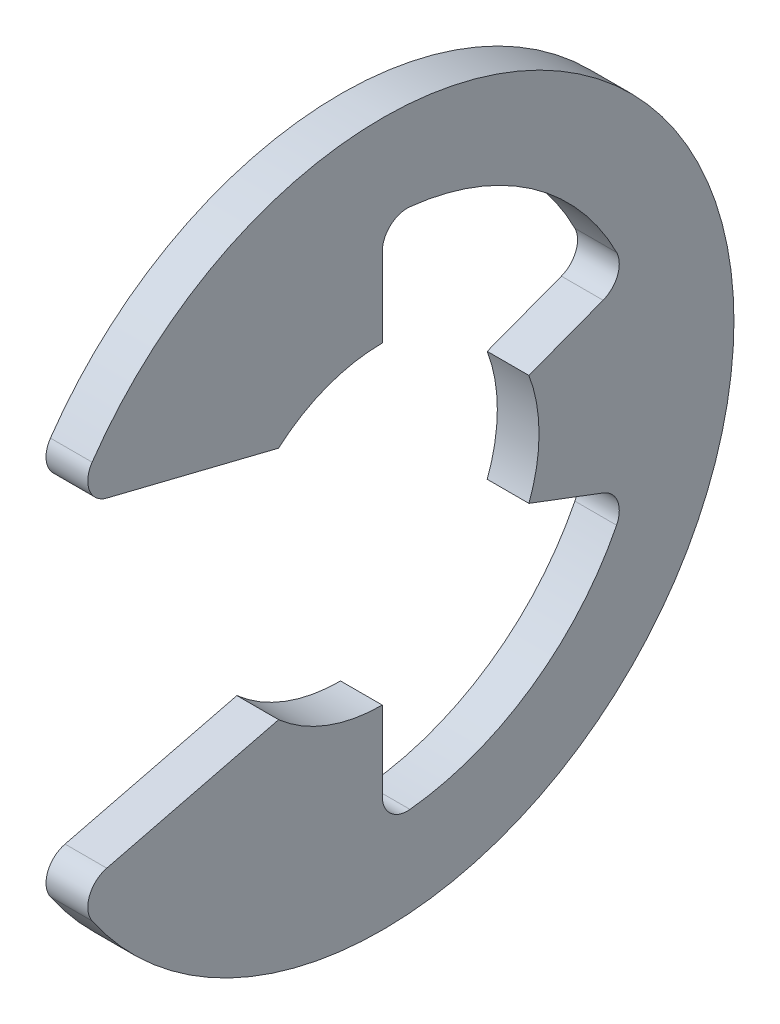
ISO-10303-21;
HEADER;
FILE_DESCRIPTION(('STEP AP214'),'2;1');
FILE_NAME('part.step','',(''),(''),'','','');
FILE_SCHEMA(('AUTOMOTIVE_DESIGN { 1 0 10303 214 1 1 1 1 }'));
ENDSEC;
DATA;
#1=APPLICATION_CONTEXT('core data for automotive mechanical design processes');
#2=APPLICATION_PROTOCOL_DEFINITION('international standard','automotive_design',2000,#1);
#3=PRODUCT_CONTEXT('',#1,'mechanical');
#4=PRODUCT('Part','Part','',(#3));
#5=PRODUCT_RELATED_PRODUCT_CATEGORY('part','',(#4));
#6=PRODUCT_DEFINITION_FORMATION('','',#4);
#7=PRODUCT_DEFINITION_CONTEXT('part definition',#1,'design');
#8=PRODUCT_DEFINITION('design','',#6,#7);
#9=PRODUCT_DEFINITION_SHAPE('','',#8);
#10=(LENGTH_UNIT() NAMED_UNIT(*) SI_UNIT(.MILLI.,.METRE.));
#11=(NAMED_UNIT(*) PLANE_ANGLE_UNIT() SI_UNIT($,.RADIAN.));
#12=(NAMED_UNIT(*) SI_UNIT($,.STERADIAN.) SOLID_ANGLE_UNIT());
#13=UNCERTAINTY_MEASURE_WITH_UNIT(LENGTH_MEASURE(1.E-05),#10,'distance_accuracy_value','');
#14=(GEOMETRIC_REPRESENTATION_CONTEXT(3) GLOBAL_UNCERTAINTY_ASSIGNED_CONTEXT((#13)) GLOBAL_UNIT_ASSIGNED_CONTEXT((#10,
#11,#12)) REPRESENTATION_CONTEXT('',''));
#15=CARTESIAN_POINT('',(0.,0.,0.));
#16=DIRECTION('',(0.,0.,1.));
#17=DIRECTION('',(1.,0.,0.));
#18=AXIS2_PLACEMENT_3D('',#15,#16,#17);
#19=CARTESIAN_POINT('',(0.35,0.,0.));
#20=DIRECTION('',(-1.,0.,0.));
#21=DIRECTION('',(0.,0.,1.));
#22=AXIS2_PLACEMENT_3D('',#19,#20,#21);
#23=CYLINDRICAL_SURFACE('',#22,5.9);
#24=CARTESIAN_POINT('',(0.35,0.,0.));
#25=DIRECTION('',(1.,0.,0.));
#26=DIRECTION('',(0.,0.,-1.));
#27=AXIS2_PLACEMENT_3D('',#24,#25,#26);
#28=CIRCLE('',#27,5.9);
#29=CARTESIAN_POINT('',(0.35,-3.33323303264902,4.86821913537768));
#30=VERTEX_POINT('',#29);
#31=CARTESIAN_POINT('',(0.35,3.33323303264902,4.86821913537768));
#32=VERTEX_POINT('',#31);
#33=EDGE_CURVE('E178',#30,#32,#28,.T.);
#34=ORIENTED_EDGE('',*,*,#33,.F.);
#35=DIRECTION('',(-1.,0.,0.));
#36=VECTOR('',#35,1.);
#37=CARTESIAN_POINT('',(0.35,-3.33323303264902,4.86821913537768));
#38=LINE('',#37,#36);
#39=CARTESIAN_POINT('',(-0.35,-3.33323303264902,4.86821913537768));
#40=VERTEX_POINT('',#39);
#41=EDGE_CURVE('E272',#30,#40,#38,.T.);
#42=ORIENTED_EDGE('',*,*,#41,.T.);
#43=CARTESIAN_POINT('',(-0.35,0.,0.));
#44=DIRECTION('',(1.,0.,0.));
#45=DIRECTION('',(0.,0.,-1.));
#46=AXIS2_PLACEMENT_3D('',#43,#44,#45);
#47=CIRCLE('',#46,5.9);
#48=CARTESIAN_POINT('',(-0.35,3.33323303264902,4.86821913537768));
#49=VERTEX_POINT('',#48);
#50=EDGE_CURVE('E220',#40,#49,#47,.T.);
#51=ORIENTED_EDGE('',*,*,#50,.T.);
#52=DIRECTION('',(-1.,0.,0.));
#53=VECTOR('',#52,1.);
#54=CARTESIAN_POINT('',(0.35,3.33323303264902,4.86821913537768));
#55=LINE('',#54,#53);
#56=EDGE_CURVE('E271',#49,#32,#55,.F.);
#57=ORIENTED_EDGE('',*,*,#56,.T.);
#58=EDGE_LOOP('',(#34,#42,#51,#57));
#59=FACE_BOUND('',#58,.T.);
#60=ADVANCED_FACE('F41',(#59),#23,.T.);
#61=CARTESIAN_POINT('',(0.35,2.82638434535392,5.17895274474852));
#62=DIRECTION('',(0.,0.970536829925373,-0.240952820606873));
#63=DIRECTION('',(0.,0.240952820606873,0.970536829925373));
#64=AXIS2_PLACEMENT_3D('',#61,#62,#63);
#65=PLANE('',#64);
#66=DIRECTION('',(0.,-0.240952820606873,-0.970536829925373));
#67=VECTOR('',#66,1.);
#68=CARTESIAN_POINT('',(0.35,2.82638434535392,5.17895274474852));
#69=LINE('',#68,#67);
#70=CARTESIAN_POINT('',(0.35,2.68832656853585,4.62286812734467));
#71=VERTEX_POINT('',#70);
#72=CARTESIAN_POINT('',(0.35,1.9725,1.73958148702497));
#73=VERTEX_POINT('',#72);
#74=EDGE_CURVE('E164',#71,#73,#69,.T.);
#75=ORIENTED_EDGE('',*,*,#74,.F.);
#76=DIRECTION('',(-1.,0.,0.));
#77=VECTOR('',#76,1.);
#78=CARTESIAN_POINT('',(0.35,2.68832656853585,4.62286812734467));
#79=LINE('',#78,#77);
#80=CARTESIAN_POINT('',(-0.35,2.68832656853585,4.62286812734467));
#81=VERTEX_POINT('',#80);
#82=EDGE_CURVE('E283',#71,#81,#79,.T.);
#83=ORIENTED_EDGE('',*,*,#82,.T.);
#84=DIRECTION('',(0.,-0.240952820606873,-0.970536829925373));
#85=VECTOR('',#84,1.);
#86=CARTESIAN_POINT('',(-0.35,2.82638434535392,5.17895274474852));
#87=LINE('',#86,#85);
#88=CARTESIAN_POINT('',(-0.35,1.9725,1.73958148702497));
#89=VERTEX_POINT('',#88);
#90=EDGE_CURVE('E183',#81,#89,#87,.T.);
#91=ORIENTED_EDGE('',*,*,#90,.T.);
#92=DIRECTION('',(-1.,0.,0.));
#93=VECTOR('',#92,1.);
#94=CARTESIAN_POINT('',(0.35,1.9725,1.73958148702497));
#95=LINE('',#94,#93);
#96=EDGE_CURVE('E185',#73,#89,#95,.T.);
#97=ORIENTED_EDGE('',*,*,#96,.F.);
#98=EDGE_LOOP('',(#75,#83,#91,#97));
#99=FACE_BOUND('',#98,.T.);
#100=ADVANCED_FACE('F181',(#99),#65,.F.);
#101=CARTESIAN_POINT('',(0.35,0.,0.));
#102=DIRECTION('',(-1.,0.,0.));
#103=DIRECTION('',(0.,0.,1.));
#104=AXIS2_PLACEMENT_3D('',#101,#102,#103);
#105=CYLINDRICAL_SURFACE('',#104,2.63);
#106=CARTESIAN_POINT('',(-0.35,0.,0.));
#107=DIRECTION('',(-1.,0.,0.));
#108=DIRECTION('',(0.,0.,1.));
#109=AXIS2_PLACEMENT_3D('',#106,#107,#108);
#110=CIRCLE('',#109,2.63);
#111=CARTESIAN_POINT('',(-0.35,2.63,0.));
#112=VERTEX_POINT('',#111);
#113=EDGE_CURVE('E222',#89,#112,#110,.T.);
#114=ORIENTED_EDGE('',*,*,#113,.T.);
#115=DIRECTION('',(-1.,0.,0.));
#116=VECTOR('',#115,1.);
#117=CARTESIAN_POINT('',(0.35,2.63,0.));
#118=LINE('',#117,#116);
#119=CARTESIAN_POINT('',(0.35,2.63,0.));
#120=VERTEX_POINT('',#119);
#121=EDGE_CURVE('E186',#120,#112,#118,.T.);
#122=ORIENTED_EDGE('',*,*,#121,.F.);
#123=CARTESIAN_POINT('',(0.35,0.,0.));
#124=DIRECTION('',(-1.,0.,0.));
#125=DIRECTION('',(0.,0.,1.));
#126=AXIS2_PLACEMENT_3D('',#123,#124,#125);
#127=CIRCLE('',#126,2.63);
#128=EDGE_CURVE('E172',#73,#120,#127,.T.);
#129=ORIENTED_EDGE('',*,*,#128,.F.);
#130=ORIENTED_EDGE('',*,*,#96,.T.);
#131=EDGE_LOOP('',(#114,#122,#129,#130));
#132=FACE_BOUND('',#131,.T.);
#133=ADVANCED_FACE('F194',(#132),#105,.F.);
#134=CARTESIAN_POINT('',(0.35,2.63,0.));
#135=DIRECTION('',(0.,0.,1.));
#136=DIRECTION('',(0.,-1.,0.));
#137=AXIS2_PLACEMENT_3D('',#134,#135,#136);
#138=PLANE('',#137);
#139=DIRECTION('',(0.,1.,0.));
#140=VECTOR('',#139,1.);
#141=CARTESIAN_POINT('',(-0.35,2.63,0.));
#142=LINE('',#141,#140);
#143=CARTESIAN_POINT('',(-0.35,3.96037227987639,0.));
#144=VERTEX_POINT('',#143);
#145=EDGE_CURVE('E224',#112,#144,#142,.T.);
#146=ORIENTED_EDGE('',*,*,#145,.T.);
#147=DIRECTION('',(1.,0.,0.));
#148=VECTOR('',#147,1.);
#149=CARTESIAN_POINT('',(0.35,3.96037227987639,0.));
#150=LINE('',#149,#148);
#151=CARTESIAN_POINT('',(0.35,3.96037227987639,0.));
#152=VERTEX_POINT('',#151);
#153=EDGE_CURVE('E267',#144,#152,#150,.T.);
#154=ORIENTED_EDGE('',*,*,#153,.T.);
#155=DIRECTION('',(0.,1.,0.));
#156=VECTOR('',#155,1.);
#157=CARTESIAN_POINT('',(0.35,2.63,0.));
#158=LINE('',#157,#156);
#159=EDGE_CURVE('E193',#120,#152,#158,.T.);
#160=ORIENTED_EDGE('',*,*,#159,.F.);
#161=ORIENTED_EDGE('',*,*,#121,.T.);
#162=EDGE_LOOP('',(#146,#154,#160,#161));
#163=FACE_BOUND('',#162,.T.);
#164=ADVANCED_FACE('F394',(#163),#138,.F.);
#165=CARTESIAN_POINT('',(0.35,0.,0.));
#166=DIRECTION('',(-1.,0.,0.));
#167=DIRECTION('',(0.,0.,1.));
#168=AXIS2_PLACEMENT_3D('',#165,#166,#167);
#169=CYLINDRICAL_SURFACE('',#168,4.40258064516129);
#170=CARTESIAN_POINT('',(0.35,0.,0.));
#171=DIRECTION('',(-1.,0.,0.));
#172=DIRECTION('',(0.,0.,-1.));
#173=AXIS2_PLACEMENT_3D('',#170,#171,#172);
#174=CIRCLE('',#173,4.40258064516129);
#175=CARTESIAN_POINT('',(0.35,4.37803020215074,-0.4642928883849));
#176=VERTEX_POINT('',#175);
#177=CARTESIAN_POINT('',(0.35,1.98217365095315,-3.93111993643235));
#178=VERTEX_POINT('',#177);
#179=EDGE_CURVE('E198',#176,#178,#174,.T.);
#180=ORIENTED_EDGE('',*,*,#179,.F.);
#181=DIRECTION('',(-1.,0.,0.));
#182=VECTOR('',#181,1.);
#183=CARTESIAN_POINT('',(0.35,4.37803020215074,-0.4642928883849));
#184=LINE('',#183,#182);
#185=CARTESIAN_POINT('',(-0.35,4.37803020215074,-0.4642928883849));
#186=VERTEX_POINT('',#185);
#187=EDGE_CURVE('E266',#176,#186,#184,.T.);
#188=ORIENTED_EDGE('',*,*,#187,.T.);
#189=CARTESIAN_POINT('',(-0.35,0.,0.));
#190=DIRECTION('',(-1.,0.,0.));
#191=DIRECTION('',(0.,0.,-1.));
#192=AXIS2_PLACEMENT_3D('',#189,#190,#191);
#193=CIRCLE('',#192,4.40258064516129);
#194=CARTESIAN_POINT('',(-0.35,1.98217365095315,-3.93111993643235));
#195=VERTEX_POINT('',#194);
#196=EDGE_CURVE('E227',#186,#195,#193,.T.);
#197=ORIENTED_EDGE('',*,*,#196,.T.);
#198=DIRECTION('',(-1.,0.,0.));
#199=VECTOR('',#198,1.);
#200=CARTESIAN_POINT('',(0.35,1.98217365095315,-3.93111993643235));
#201=LINE('',#200,#199);
#202=EDGE_CURVE('E262',#195,#178,#201,.F.);
#203=ORIENTED_EDGE('',*,*,#202,.T.);
#204=EDGE_LOOP('',(#180,#188,#197,#203));
#205=FACE_BOUND('',#204,.T.);
#206=ADVANCED_FACE('F311',(#205),#169,.F.);
#207=CARTESIAN_POINT('',(0.35,0.92984541726031,-2.46013973180387));
#208=DIRECTION('',(0.,-0.935414346693484,-0.353553390593276));
#209=DIRECTION('',(0.,0.353553390593276,-0.935414346693485));
#210=AXIS2_PLACEMENT_3D('',#207,#208,#209);
#211=PLANE('',#210);
#212=DIRECTION('',(0.,-0.353553390593276,0.935414346693484));
#213=VECTOR('',#212,1.);
#214=CARTESIAN_POINT('',(0.35,0.92984541726031,-2.46013973180387));
#215=LINE('',#214,#213);
#216=CARTESIAN_POINT('',(0.35,1.40020304756192,-3.70458904884356));
#217=VERTEX_POINT('',#216);
#218=CARTESIAN_POINT('',(0.35,0.92984541726031,-2.46013973180387));
#219=VERTEX_POINT('',#218);
#220=EDGE_CURVE('E203',#217,#219,#215,.T.);
#221=ORIENTED_EDGE('',*,*,#220,.F.);
#222=DIRECTION('',(1.,0.,0.));
#223=VECTOR('',#222,1.);
#224=CARTESIAN_POINT('',(-0.35,1.40020304756192,-3.70458904884356));
#225=LINE('',#224,#223);
#226=CARTESIAN_POINT('',(-0.35,1.40020304756192,-3.70458904884356));
#227=VERTEX_POINT('',#226);
#228=EDGE_CURVE('E289',#217,#227,#225,.F.);
#229=ORIENTED_EDGE('',*,*,#228,.T.);
#230=DIRECTION('',(0.,-0.353553390593276,0.935414346693484));
#231=VECTOR('',#230,1.);
#232=CARTESIAN_POINT('',(-0.35,0.92984541726031,-2.46013973180387));
#233=LINE('',#232,#231);
#234=CARTESIAN_POINT('',(-0.35,0.92984541726031,-2.46013973180387));
#235=VERTEX_POINT('',#234);
#236=EDGE_CURVE('E226',#227,#235,#233,.T.);
#237=ORIENTED_EDGE('',*,*,#236,.T.);
#238=DIRECTION('',(-1.,0.,0.));
#239=VECTOR('',#238,1.);
#240=CARTESIAN_POINT('',(0.35,0.92984541726031,-2.46013973180387));
#241=LINE('',#240,#239);
#242=EDGE_CURVE('E251',#219,#235,#241,.T.);
#243=ORIENTED_EDGE('',*,*,#242,.F.);
#244=EDGE_LOOP('',(#221,#229,#237,#243));
#245=FACE_BOUND('',#244,.T.);
#246=ADVANCED_FACE('F316',(#245),#211,.F.);
#247=CARTESIAN_POINT('',(0.35,0.,0.));
#248=DIRECTION('',(-1.,0.,0.));
#249=DIRECTION('',(0.,0.,1.));
#250=AXIS2_PLACEMENT_3D('',#247,#248,#249);
#251=CYLINDRICAL_SURFACE('',#250,2.63);
#252=CARTESIAN_POINT('',(-0.35,0.,0.));
#253=DIRECTION('',(-1.,0.,0.));
#254=DIRECTION('',(0.,0.,1.));
#255=AXIS2_PLACEMENT_3D('',#252,#253,#254);
#256=CIRCLE('',#255,2.63);
#257=CARTESIAN_POINT('',(-0.35,-0.92984541726031,-2.46013973180387));
#258=VERTEX_POINT('',#257);
#259=EDGE_CURVE('E231',#235,#258,#256,.T.);
#260=ORIENTED_EDGE('',*,*,#259,.T.);
#261=DIRECTION('',(-1.,0.,0.));
#262=VECTOR('',#261,1.);
#263=CARTESIAN_POINT('',(0.35,-0.92984541726031,-2.46013973180387));
#264=LINE('',#263,#262);
#265=CARTESIAN_POINT('',(0.35,-0.92984541726031,-2.46013973180387));
#266=VERTEX_POINT('',#265);
#267=EDGE_CURVE('E247',#266,#258,#264,.T.);
#268=ORIENTED_EDGE('',*,*,#267,.F.);
#269=CARTESIAN_POINT('',(0.35,0.,0.));
#270=DIRECTION('',(-1.,0.,0.));
#271=DIRECTION('',(0.,0.,1.));
#272=AXIS2_PLACEMENT_3D('',#269,#270,#271);
#273=CIRCLE('',#272,2.63);
#274=EDGE_CURVE('E201',#219,#266,#273,.T.);
#275=ORIENTED_EDGE('',*,*,#274,.F.);
#276=ORIENTED_EDGE('',*,*,#242,.T.);
#277=EDGE_LOOP('',(#260,#268,#275,#276));
#278=FACE_BOUND('',#277,.T.);
#279=ADVANCED_FACE('F325',(#278),#251,.F.);
#280=CARTESIAN_POINT('',(0.35,-0.92984541726031,-2.46013973180387));
#281=DIRECTION('',(0.,0.935414346693485,-0.353553390593276));
#282=DIRECTION('',(0.,0.353553390593276,0.935414346693485));
#283=AXIS2_PLACEMENT_3D('',#280,#281,#282);
#284=PLANE('',#283);
#285=DIRECTION('',(0.,-0.353553390593276,-0.935414346693485));
#286=VECTOR('',#285,1.);
#287=CARTESIAN_POINT('',(-0.35,-0.92984541726031,-2.46013973180387));
#288=LINE('',#287,#286);
#289=CARTESIAN_POINT('',(-0.35,-1.40020304756192,-3.70458904884357));
#290=VERTEX_POINT('',#289);
#291=EDGE_CURVE('E234',#258,#290,#288,.T.);
#292=ORIENTED_EDGE('',*,*,#291,.T.);
#293=DIRECTION('',(1.,0.,0.));
#294=VECTOR('',#293,1.);
#295=CARTESIAN_POINT('',(0.35,-1.40020304756191,-3.70458904884357));
#296=LINE('',#295,#294);
#297=CARTESIAN_POINT('',(0.35,-1.40020304756192,-3.70458904884357));
#298=VERTEX_POINT('',#297);
#299=EDGE_CURVE('E57',#290,#298,#296,.T.);
#300=ORIENTED_EDGE('',*,*,#299,.T.);
#301=DIRECTION('',(0.,-0.353553390593276,-0.935414346693485));
#302=VECTOR('',#301,1.);
#303=CARTESIAN_POINT('',(0.35,-0.92984541726031,-2.46013973180387));
#304=LINE('',#303,#302);
#305=EDGE_CURVE('E202',#266,#298,#304,.T.);
#306=ORIENTED_EDGE('',*,*,#305,.F.);
#307=ORIENTED_EDGE('',*,*,#267,.T.);
#308=EDGE_LOOP('',(#292,#300,#306,#307));
#309=FACE_BOUND('',#308,.T.);
#310=ADVANCED_FACE('F322',(#309),#284,.F.);
#311=CARTESIAN_POINT('',(0.35,0.,0.));
#312=DIRECTION('',(-1.,0.,0.));
#313=DIRECTION('',(0.,0.,1.));
#314=AXIS2_PLACEMENT_3D('',#311,#312,#313);
#315=CYLINDRICAL_SURFACE('',#314,4.40258064516129);
#316=CARTESIAN_POINT('',(-0.35,0.,0.));
#317=DIRECTION('',(-1.,0.,0.));
#318=DIRECTION('',(0.,0.,-1.));
#319=AXIS2_PLACEMENT_3D('',#316,#317,#318);
#320=CIRCLE('',#319,4.40258064516129);
#321=CARTESIAN_POINT('',(-0.35,-1.98217365095315,-3.93111993643235));
#322=VERTEX_POINT('',#321);
#323=CARTESIAN_POINT('',(-0.35,-4.37803020215074,-0.464292888384901));
#324=VERTEX_POINT('',#323);
#325=EDGE_CURVE('E235',#322,#324,#320,.T.);
#326=ORIENTED_EDGE('',*,*,#325,.T.);
#327=DIRECTION('',(-1.,0.,0.));
#328=VECTOR('',#327,1.);
#329=CARTESIAN_POINT('',(0.35,-4.37803020215074,-0.464292888384901));
#330=LINE('',#329,#328);
#331=CARTESIAN_POINT('',(0.35,-4.37803020215074,-0.464292888384901));
#332=VERTEX_POINT('',#331);
#333=EDGE_CURVE('E265',#324,#332,#330,.F.);
#334=ORIENTED_EDGE('',*,*,#333,.T.);
#335=CARTESIAN_POINT('',(0.35,0.,0.));
#336=DIRECTION('',(-1.,0.,0.));
#337=DIRECTION('',(0.,0.,-1.));
#338=AXIS2_PLACEMENT_3D('',#335,#336,#337);
#339=CIRCLE('',#338,4.40258064516129);
#340=CARTESIAN_POINT('',(0.35,-1.98217365095315,-3.93111993643235));
#341=VERTEX_POINT('',#340);
#342=EDGE_CURVE('E210',#341,#332,#339,.T.);
#343=ORIENTED_EDGE('',*,*,#342,.F.);
#344=DIRECTION('',(-1.,0.,0.));
#345=VECTOR('',#344,1.);
#346=CARTESIAN_POINT('',(0.35,-1.98217365095315,-3.93111993643235));
#347=LINE('',#346,#345);
#348=EDGE_CURVE('E259',#341,#322,#347,.T.);
#349=ORIENTED_EDGE('',*,*,#348,.T.);
#350=EDGE_LOOP('',(#326,#334,#343,#349));
#351=FACE_BOUND('',#350,.T.);
#352=ADVANCED_FACE('F326',(#351),#315,.F.);
#353=CARTESIAN_POINT('',(0.35,-2.63,0.));
#354=DIRECTION('',(0.,0.,1.));
#355=DIRECTION('',(0.,-1.,0.));
#356=AXIS2_PLACEMENT_3D('',#353,#354,#355);
#357=PLANE('',#356);
#358=DIRECTION('',(0.,1.,0.));
#359=VECTOR('',#358,1.);
#360=CARTESIAN_POINT('',(0.35,-2.63,0.));
#361=LINE('',#360,#359);
#362=CARTESIAN_POINT('',(0.35,-3.96037227987639,0.));
#363=VERTEX_POINT('',#362);
#364=CARTESIAN_POINT('',(0.35,-2.63,0.));
#365=VERTEX_POINT('',#364);
#366=EDGE_CURVE('E209',#363,#365,#361,.T.);
#367=ORIENTED_EDGE('',*,*,#366,.F.);
#368=DIRECTION('',(1.,0.,0.));
#369=VECTOR('',#368,1.);
#370=CARTESIAN_POINT('',(-0.35,-3.96037227987639,0.));
#371=LINE('',#370,#369);
#372=CARTESIAN_POINT('',(-0.35,-3.96037227987639,0.));
#373=VERTEX_POINT('',#372);
#374=EDGE_CURVE('E189',#363,#373,#371,.F.);
#375=ORIENTED_EDGE('',*,*,#374,.T.);
#376=DIRECTION('',(0.,1.,0.));
#377=VECTOR('',#376,1.);
#378=CARTESIAN_POINT('',(-0.35,-2.63,0.));
#379=LINE('',#378,#377);
#380=CARTESIAN_POINT('',(-0.35,-2.63,0.));
#381=VERTEX_POINT('',#380);
#382=EDGE_CURVE('E236',#373,#381,#379,.T.);
#383=ORIENTED_EDGE('',*,*,#382,.T.);
#384=DIRECTION('',(-1.,0.,0.));
#385=VECTOR('',#384,1.);
#386=CARTESIAN_POINT('',(0.35,-2.63,0.));
#387=LINE('',#386,#385);
#388=EDGE_CURVE('E246',#365,#381,#387,.T.);
#389=ORIENTED_EDGE('',*,*,#388,.F.);
#390=EDGE_LOOP('',(#367,#375,#383,#389));
#391=FACE_BOUND('',#390,.T.);
#392=ADVANCED_FACE('F335',(#391),#357,.F.);
#393=CARTESIAN_POINT('',(0.35,0.,0.));
#394=DIRECTION('',(-1.,0.,0.));
#395=DIRECTION('',(0.,0.,1.));
#396=AXIS2_PLACEMENT_3D('',#393,#394,#395);
#397=CYLINDRICAL_SURFACE('',#396,2.63);
#398=CARTESIAN_POINT('',(-0.35,0.,0.));
#399=DIRECTION('',(-1.,0.,0.));
#400=DIRECTION('',(0.,0.,-1.));
#401=AXIS2_PLACEMENT_3D('',#398,#399,#400);
#402=CIRCLE('',#401,2.63);
#403=CARTESIAN_POINT('',(-0.35,-1.9725,1.73958148702497));
#404=VERTEX_POINT('',#403);
#405=EDGE_CURVE('E238',#381,#404,#402,.T.);
#406=ORIENTED_EDGE('',*,*,#405,.T.);
#407=DIRECTION('',(-1.,0.,0.));
#408=VECTOR('',#407,1.);
#409=CARTESIAN_POINT('',(0.35,-1.9725,1.73958148702497));
#410=LINE('',#409,#408);
#411=CARTESIAN_POINT('',(0.35,-1.9725,1.73958148702497));
#412=VERTEX_POINT('',#411);
#413=EDGE_CURVE('E216',#412,#404,#410,.T.);
#414=ORIENTED_EDGE('',*,*,#413,.F.);
#415=CARTESIAN_POINT('',(0.35,0.,0.));
#416=DIRECTION('',(-1.,0.,0.));
#417=DIRECTION('',(0.,0.,-1.));
#418=AXIS2_PLACEMENT_3D('',#415,#416,#417);
#419=CIRCLE('',#418,2.63);
#420=EDGE_CURVE('E215',#365,#412,#419,.T.);
#421=ORIENTED_EDGE('',*,*,#420,.F.);
#422=ORIENTED_EDGE('',*,*,#388,.T.);
#423=EDGE_LOOP('',(#406,#414,#421,#422));
#424=FACE_BOUND('',#423,.T.);
#425=ADVANCED_FACE('F382',(#424),#397,.F.);
#426=CARTESIAN_POINT('',(0.35,-2.82638434535392,5.17895274474852));
#427=DIRECTION('',(0.,-0.970536829925373,-0.240952820606873));
#428=DIRECTION('',(0.,0.240952820606873,-0.970536829925373));
#429=AXIS2_PLACEMENT_3D('',#426,#427,#428);
#430=PLANE('',#429);
#431=DIRECTION('',(0.,-0.240952820606873,0.970536829925373));
#432=VECTOR('',#431,1.);
#433=CARTESIAN_POINT('',(-0.35,-2.82638434535392,5.17895274474852));
#434=LINE('',#433,#432);
#435=CARTESIAN_POINT('',(-0.35,-2.68832656853585,4.62286812734467));
#436=VERTEX_POINT('',#435);
#437=EDGE_CURVE('E245',#404,#436,#434,.T.);
#438=ORIENTED_EDGE('',*,*,#437,.T.);
#439=DIRECTION('',(-1.,0.,0.));
#440=VECTOR('',#439,1.);
#441=CARTESIAN_POINT('',(0.35,-2.68832656853585,4.62286812734467));
#442=LINE('',#441,#440);
#443=CARTESIAN_POINT('',(0.35,-2.68832656853585,4.62286812734467));
#444=VERTEX_POINT('',#443);
#445=EDGE_CURVE('E278',#436,#444,#442,.F.);
#446=ORIENTED_EDGE('',*,*,#445,.T.);
#447=DIRECTION('',(0.,-0.240952820606873,0.970536829925373));
#448=VECTOR('',#447,1.);
#449=CARTESIAN_POINT('',(0.35,-2.82638434535392,5.17895274474852));
#450=LINE('',#449,#448);
#451=EDGE_CURVE('E212',#412,#444,#450,.T.);
#452=ORIENTED_EDGE('',*,*,#451,.F.);
#453=ORIENTED_EDGE('',*,*,#413,.T.);
#454=EDGE_LOOP('',(#438,#446,#452,#453));
#455=FACE_BOUND('',#454,.T.);
#456=ADVANCED_FACE('F429',(#455),#430,.F.);
#457=CARTESIAN_POINT('',(0.35,0.,0.));
#458=DIRECTION('',(1.,0.,0.));
#459=DIRECTION('',(0.,0.,-1.));
#460=AXIS2_PLACEMENT_3D('',#457,#458,#459);
#461=PLANE('',#460);
#462=ORIENTED_EDGE('',*,*,#451,.T.);
#463=CARTESIAN_POINT('',(0.35,-3.09595203710451,4.52166794268978));
#464=DIRECTION('',(1.,0.,0.));
#465=DIRECTION('',(0.,0.,-1.));
#466=AXIS2_PLACEMENT_3D('',#463,#464,#465);
#467=CIRCLE('',#466,0.42);
#468=EDGE_CURVE('E284',#444,#30,#467,.T.);
#469=ORIENTED_EDGE('',*,*,#468,.T.);
#470=ORIENTED_EDGE('',*,*,#33,.T.);
#471=CARTESIAN_POINT('',(0.35,3.09595203710451,4.52166794268978));
#472=DIRECTION('',(1.,0.,0.));
#473=DIRECTION('',(0.,0.,-1.));
#474=AXIS2_PLACEMENT_3D('',#471,#472,#473);
#475=CIRCLE('',#474,0.42);
#476=EDGE_CURVE('E173',#32,#71,#475,.T.);
#477=ORIENTED_EDGE('',*,*,#476,.T.);
#478=ORIENTED_EDGE('',*,*,#74,.T.);
#479=ORIENTED_EDGE('',*,*,#128,.T.);
#480=ORIENTED_EDGE('',*,*,#159,.T.);
#481=CARTESIAN_POINT('',(0.35,3.96037227987639,-0.419999999999998));
#482=DIRECTION('',(1.,0.,0.));
#483=DIRECTION('',(0.,0.,-1.));
#484=AXIS2_PLACEMENT_3D('',#481,#482,#483);
#485=CIRCLE('',#484,0.42);
#486=EDGE_CURVE('E300',#152,#176,#485,.F.);
#487=ORIENTED_EDGE('',*,*,#486,.T.);
#488=ORIENTED_EDGE('',*,*,#179,.T.);
#489=CARTESIAN_POINT('',(0.35,1.79307707317318,-3.55609662479439));
#490=DIRECTION('',(1.,0.,0.));
#491=DIRECTION('',(0.,0.,-1.));
#492=AXIS2_PLACEMENT_3D('',#489,#490,#491);
#493=CIRCLE('',#492,0.42);
#494=EDGE_CURVE('E11',#178,#217,#493,.F.);
#495=ORIENTED_EDGE('',*,*,#494,.T.);
#496=ORIENTED_EDGE('',*,*,#220,.T.);
#497=ORIENTED_EDGE('',*,*,#274,.T.);
#498=ORIENTED_EDGE('',*,*,#305,.T.);
#499=CARTESIAN_POINT('',(0.35,-1.79307707317318,-3.55609662479439));
#500=DIRECTION('',(1.,0.,0.));
#501=DIRECTION('',(0.,0.,-1.));
#502=AXIS2_PLACEMENT_3D('',#499,#500,#501);
#503=CIRCLE('',#502,0.42);
#504=EDGE_CURVE('E304',#298,#341,#503,.F.);
#505=ORIENTED_EDGE('',*,*,#504,.T.);
#506=ORIENTED_EDGE('',*,*,#342,.T.);
#507=CARTESIAN_POINT('',(0.35,-3.96037227987639,-0.419999999999999));
#508=DIRECTION('',(1.,0.,0.));
#509=DIRECTION('',(0.,0.,-1.));
#510=AXIS2_PLACEMENT_3D('',#507,#508,#509);
#511=CIRCLE('',#510,0.42);
#512=EDGE_CURVE('E291',#332,#363,#511,.F.);
#513=ORIENTED_EDGE('',*,*,#512,.T.);
#514=ORIENTED_EDGE('',*,*,#366,.T.);
#515=ORIENTED_EDGE('',*,*,#420,.T.);
#516=EDGE_LOOP('',(#462,#469,#470,#477,#478,#479,#480,#487,#488,#495,#496,#497,#498,#505,#506,
#513,#514,#515));
#517=FACE_BOUND('',#516,.T.);
#518=ADVANCED_FACE('F169',(#517),#461,.T.);
#519=CARTESIAN_POINT('',(-0.35,0.,0.));
#520=DIRECTION('',(1.,0.,0.));
#521=DIRECTION('',(0.,0.,-1.));
#522=AXIS2_PLACEMENT_3D('',#519,#520,#521);
#523=PLANE('',#522);
#524=ORIENTED_EDGE('',*,*,#50,.F.);
#525=CARTESIAN_POINT('',(-0.35,-3.09595203710451,4.52166794268978));
#526=DIRECTION('',(1.,0.,0.));
#527=DIRECTION('',(0.,0.,-1.));
#528=AXIS2_PLACEMENT_3D('',#525,#526,#527);
#529=CIRCLE('',#528,0.42);
#530=EDGE_CURVE('E279',#40,#436,#529,.F.);
#531=ORIENTED_EDGE('',*,*,#530,.T.);
#532=ORIENTED_EDGE('',*,*,#437,.F.);
#533=ORIENTED_EDGE('',*,*,#405,.F.);
#534=ORIENTED_EDGE('',*,*,#382,.F.);
#535=CARTESIAN_POINT('',(-0.35,-3.96037227987639,-0.419999999999999));
#536=DIRECTION('',(1.,0.,0.));
#537=DIRECTION('',(0.,0.,-1.));
#538=AXIS2_PLACEMENT_3D('',#535,#536,#537);
#539=CIRCLE('',#538,0.42);
#540=EDGE_CURVE('E292',#373,#324,#539,.T.);
#541=ORIENTED_EDGE('',*,*,#540,.T.);
#542=ORIENTED_EDGE('',*,*,#325,.F.);
#543=CARTESIAN_POINT('',(-0.35,-1.79307707317318,-3.55609662479439));
#544=DIRECTION('',(1.,0.,0.));
#545=DIRECTION('',(0.,0.,-1.));
#546=AXIS2_PLACEMENT_3D('',#543,#544,#545);
#547=CIRCLE('',#546,0.42);
#548=EDGE_CURVE('E296',#322,#290,#547,.T.);
#549=ORIENTED_EDGE('',*,*,#548,.T.);
#550=ORIENTED_EDGE('',*,*,#291,.F.);
#551=ORIENTED_EDGE('',*,*,#259,.F.);
#552=ORIENTED_EDGE('',*,*,#236,.F.);
#553=CARTESIAN_POINT('',(-0.35,1.79307707317318,-3.55609662479439));
#554=DIRECTION('',(1.,0.,0.));
#555=DIRECTION('',(0.,0.,-1.));
#556=AXIS2_PLACEMENT_3D('',#553,#554,#555);
#557=CIRCLE('',#556,0.42);
#558=EDGE_CURVE('E47',#227,#195,#557,.T.);
#559=ORIENTED_EDGE('',*,*,#558,.T.);
#560=ORIENTED_EDGE('',*,*,#196,.F.);
#561=CARTESIAN_POINT('',(-0.35,3.96037227987639,-0.419999999999998));
#562=DIRECTION('',(1.,0.,0.));
#563=DIRECTION('',(0.,0.,-1.));
#564=AXIS2_PLACEMENT_3D('',#561,#562,#563);
#565=CIRCLE('',#564,0.42);
#566=EDGE_CURVE('E293',#186,#144,#565,.T.);
#567=ORIENTED_EDGE('',*,*,#566,.T.);
#568=ORIENTED_EDGE('',*,*,#145,.F.);
#569=ORIENTED_EDGE('',*,*,#113,.F.);
#570=ORIENTED_EDGE('',*,*,#90,.F.);
#571=CARTESIAN_POINT('',(-0.35,3.09595203710451,4.52166794268978));
#572=DIRECTION('',(1.,0.,0.));
#573=DIRECTION('',(0.,0.,-1.));
#574=AXIS2_PLACEMENT_3D('',#571,#572,#573);
#575=CIRCLE('',#574,0.42);
#576=EDGE_CURVE('E277',#81,#49,#575,.F.);
#577=ORIENTED_EDGE('',*,*,#576,.T.);
#578=EDGE_LOOP('',(#524,#531,#532,#533,#534,#541,#542,#549,#550,#551,#552,#559,#560,#567,#568,
#569,#570,#577));
#579=FACE_BOUND('',#578,.T.);
#580=ADVANCED_FACE('F308',(#579),#523,.F.);
#581=CARTESIAN_POINT('',(0.35,-3.96037227987639,-0.419999999999999));
#582=DIRECTION('',(-1.,0.,0.));
#583=DIRECTION('',(0.,0.,1.));
#584=AXIS2_PLACEMENT_3D('',#581,#582,#583);
#585=CYLINDRICAL_SURFACE('',#584,0.42);
#586=ORIENTED_EDGE('',*,*,#512,.F.);
#587=ORIENTED_EDGE('',*,*,#333,.F.);
#588=ORIENTED_EDGE('',*,*,#540,.F.);
#589=ORIENTED_EDGE('',*,*,#374,.F.);
#590=EDGE_LOOP('',(#586,#587,#588,#589));
#591=FACE_BOUND('',#590,.T.);
#592=ADVANCED_FACE('F346',(#591),#585,.F.);
#593=CARTESIAN_POINT('',(0.35,3.96037227987639,-0.419999999999998));
#594=DIRECTION('',(-1.,0.,0.));
#595=DIRECTION('',(0.,0.,1.));
#596=AXIS2_PLACEMENT_3D('',#593,#594,#595);
#597=CYLINDRICAL_SURFACE('',#596,0.42);
#598=ORIENTED_EDGE('',*,*,#486,.F.);
#599=ORIENTED_EDGE('',*,*,#153,.F.);
#600=ORIENTED_EDGE('',*,*,#566,.F.);
#601=ORIENTED_EDGE('',*,*,#187,.F.);
#602=EDGE_LOOP('',(#598,#599,#600,#601));
#603=FACE_BOUND('',#602,.T.);
#604=ADVANCED_FACE('F352',(#603),#597,.F.);
#605=CARTESIAN_POINT('',(0.35,-3.09595203710451,4.52166794268978));
#606=DIRECTION('',(-1.,0.,0.));
#607=DIRECTION('',(0.,0.,1.));
#608=AXIS2_PLACEMENT_3D('',#605,#606,#607);
#609=CYLINDRICAL_SURFACE('',#608,0.42);
#610=ORIENTED_EDGE('',*,*,#468,.F.);
#611=ORIENTED_EDGE('',*,*,#445,.F.);
#612=ORIENTED_EDGE('',*,*,#530,.F.);
#613=ORIENTED_EDGE('',*,*,#41,.F.);
#614=EDGE_LOOP('',(#610,#611,#612,#613));
#615=FACE_BOUND('',#614,.T.);
#616=ADVANCED_FACE('F353',(#615),#609,.T.);
#617=CARTESIAN_POINT('',(0.35,3.09595203710451,4.52166794268978));
#618=DIRECTION('',(-1.,0.,0.));
#619=DIRECTION('',(0.,0.,1.));
#620=AXIS2_PLACEMENT_3D('',#617,#618,#619);
#621=CYLINDRICAL_SURFACE('',#620,0.42);
#622=ORIENTED_EDGE('',*,*,#476,.F.);
#623=ORIENTED_EDGE('',*,*,#56,.F.);
#624=ORIENTED_EDGE('',*,*,#576,.F.);
#625=ORIENTED_EDGE('',*,*,#82,.F.);
#626=EDGE_LOOP('',(#622,#623,#624,#625));
#627=FACE_BOUND('',#626,.T.);
#628=ADVANCED_FACE('F358',(#627),#621,.T.);
#629=CARTESIAN_POINT('',(0.35,-1.79307707317318,-3.55609662479439));
#630=DIRECTION('',(-1.,0.,0.));
#631=DIRECTION('',(0.,0.,1.));
#632=AXIS2_PLACEMENT_3D('',#629,#630,#631);
#633=CYLINDRICAL_SURFACE('',#632,0.42);
#634=ORIENTED_EDGE('',*,*,#504,.F.);
#635=ORIENTED_EDGE('',*,*,#299,.F.);
#636=ORIENTED_EDGE('',*,*,#548,.F.);
#637=ORIENTED_EDGE('',*,*,#348,.F.);
#638=EDGE_LOOP('',(#634,#635,#636,#637));
#639=FACE_BOUND('',#638,.T.);
#640=ADVANCED_FACE('F362',(#639),#633,.F.);
#641=CARTESIAN_POINT('',(0.35,1.79307707317318,-3.55609662479439));
#642=DIRECTION('',(-1.,0.,0.));
#643=DIRECTION('',(0.,0.,1.));
#644=AXIS2_PLACEMENT_3D('',#641,#642,#643);
#645=CYLINDRICAL_SURFACE('',#644,0.42);
#646=ORIENTED_EDGE('',*,*,#494,.F.);
#647=ORIENTED_EDGE('',*,*,#202,.F.);
#648=ORIENTED_EDGE('',*,*,#558,.F.);
#649=ORIENTED_EDGE('',*,*,#228,.F.);
#650=EDGE_LOOP('',(#646,#647,#648,#649));
#651=FACE_BOUND('',#650,.T.);
#652=ADVANCED_FACE('F43',(#651),#645,.F.);
#653=CLOSED_SHELL('',(#60,#100,#133,#164,#206,#246,#279,#310,#352,#392,#425,#456,#518,#580,#592,
#604,#616,#628,#640,#652));
#654=MANIFOLD_SOLID_BREP('B2',#653);
#655=ADVANCED_BREP_SHAPE_REPRESENTATION('',(#18,#654),#14);
#656=SHAPE_DEFINITION_REPRESENTATION(#9,#655);
ENDSEC;
END-ISO-10303-21;
